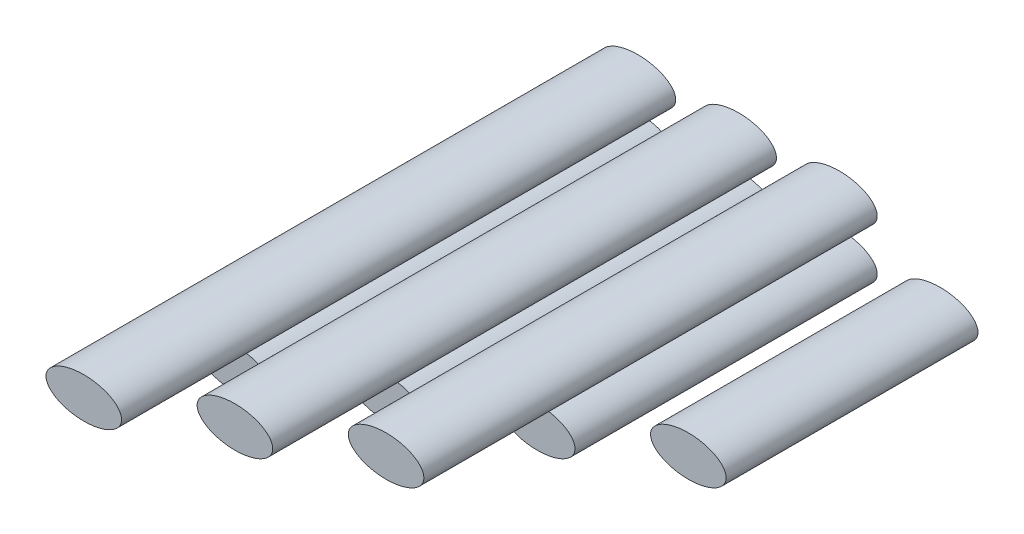
ISO-10303-21;
HEADER;
FILE_DESCRIPTION(('STEP AP214'),'2;1');
FILE_NAME('part.step','',(''),(''),'','','');
FILE_SCHEMA(('AUTOMOTIVE_DESIGN { 1 0 10303 214 1 1 1 1 }'));
ENDSEC;
DATA;
#1=APPLICATION_CONTEXT('core data for automotive mechanical design processes');
#2=APPLICATION_PROTOCOL_DEFINITION('international standard','automotive_design',2000,#1);
#3=PRODUCT_CONTEXT('',#1,'mechanical');
#4=PRODUCT('Part','Part','',(#3));
#5=PRODUCT_RELATED_PRODUCT_CATEGORY('part','',(#4));
#6=PRODUCT_DEFINITION_FORMATION('','',#4);
#7=PRODUCT_DEFINITION_CONTEXT('part definition',#1,'design');
#8=PRODUCT_DEFINITION('design','',#6,#7);
#9=PRODUCT_DEFINITION_SHAPE('','',#8);
#10=(LENGTH_UNIT() NAMED_UNIT(*) SI_UNIT(.MILLI.,.METRE.));
#11=(NAMED_UNIT(*) PLANE_ANGLE_UNIT() SI_UNIT($,.RADIAN.));
#12=(NAMED_UNIT(*) SI_UNIT($,.STERADIAN.) SOLID_ANGLE_UNIT());
#13=UNCERTAINTY_MEASURE_WITH_UNIT(LENGTH_MEASURE(1.E-05),#10,'distance_accuracy_value','');
#14=(GEOMETRIC_REPRESENTATION_CONTEXT(3) GLOBAL_UNCERTAINTY_ASSIGNED_CONTEXT((#13)) GLOBAL_UNIT_ASSIGNED_CONTEXT((#10,
#11,#12)) REPRESENTATION_CONTEXT('',''));
#15=CARTESIAN_POINT('',(0.,0.,0.));
#16=DIRECTION('',(0.,0.,1.));
#17=DIRECTION('',(1.,0.,0.));
#18=AXIS2_PLACEMENT_3D('',#15,#16,#17);
#19=CARTESIAN_POINT('',(0.,2.,22.));
#20=DIRECTION('',(0.,0.,1.));
#21=DIRECTION('',(-1.,0.,0.));
#22=AXIS2_PLACEMENT_3D('',#19,#20,#21);
#23=ELLIPSE('',#22,1.5,0.8);
#24=DIRECTION('',(0.,0.,-1.));
#25=VECTOR('',#24,1.);
#26=SURFACE_OF_LINEAR_EXTRUSION('',#23,#25);
#27=CARTESIAN_POINT('',(-1.50000000000001,2.,22.));
#28=VERTEX_POINT('',#27);
#29=EDGE_CURVE('E11',#28,#28,#23,.T.);
#30=ORIENTED_EDGE('',*,*,#29,.F.);
#31=EDGE_LOOP('',(#30));
#32=FACE_BOUND('',#31,.T.);
#33=CARTESIAN_POINT('',(0.,2.,0.));
#34=DIRECTION('',(0.,0.,1.));
#35=DIRECTION('',(-1.,0.,0.));
#36=AXIS2_PLACEMENT_3D('',#33,#34,#35);
#37=ELLIPSE('',#36,1.5,0.8);
#38=CARTESIAN_POINT('',(-1.50000000000001,2.,0.));
#39=VERTEX_POINT('',#38);
#40=EDGE_CURVE('E44',#39,#39,#37,.T.);
#41=ORIENTED_EDGE('',*,*,#40,.T.);
#42=EDGE_LOOP('',(#41));
#43=FACE_BOUND('',#42,.T.);
#44=ADVANCED_FACE('F40',(#32,#43),#26,.F.);
#45=CARTESIAN_POINT('',(0.,2.,22.));
#46=DIRECTION('',(0.,0.,1.));
#47=DIRECTION('',(1.,0.,0.));
#48=AXIS2_PLACEMENT_3D('',#45,#46,#47);
#49=PLANE('',#48);
#50=ORIENTED_EDGE('',*,*,#29,.T.);
#51=EDGE_LOOP('',(#50));
#52=FACE_BOUND('',#51,.T.);
#53=ADVANCED_FACE('F56',(#52),#49,.T.);
#54=CARTESIAN_POINT('',(0.,2.,0.));
#55=DIRECTION('',(0.,0.,1.));
#56=DIRECTION('',(1.,0.,0.));
#57=AXIS2_PLACEMENT_3D('',#54,#55,#56);
#58=PLANE('',#57);
#59=ORIENTED_EDGE('',*,*,#40,.F.);
#60=EDGE_LOOP('',(#59));
#61=FACE_BOUND('',#60,.T.);
#62=ADVANCED_FACE('F54',(#61),#58,.F.);
#63=CLOSED_SHELL('',(#44,#53,#62));
#64=MANIFOLD_SOLID_BREP('B2',#63);
#65=CARTESIAN_POINT('',(3.99999999999999,2.00000000000006,20.));
#66=DIRECTION('',(0.,0.,1.));
#67=DIRECTION('',(-1.,0.,0.));
#68=AXIS2_PLACEMENT_3D('',#65,#66,#67);
#69=ELLIPSE('',#68,1.5,0.8);
#70=DIRECTION('',(0.,0.,-1.));
#71=VECTOR('',#70,1.);
#72=SURFACE_OF_LINEAR_EXTRUSION('',#69,#71);
#73=CARTESIAN_POINT('',(2.49999999999999,2.00000000000006,20.));
#74=VERTEX_POINT('',#73);
#75=EDGE_CURVE('E39',#74,#74,#69,.T.);
#76=ORIENTED_EDGE('',*,*,#75,.F.);
#77=EDGE_LOOP('',(#76));
#78=FACE_BOUND('',#77,.T.);
#79=CARTESIAN_POINT('',(3.99999999999999,2.00000000000006,0.));
#80=DIRECTION('',(0.,0.,1.));
#81=DIRECTION('',(-1.,0.,0.));
#82=AXIS2_PLACEMENT_3D('',#79,#80,#81);
#83=ELLIPSE('',#82,1.5,0.8);
#84=CARTESIAN_POINT('',(2.49999999999999,2.00000000000006,0.));
#85=VERTEX_POINT('',#84);
#86=EDGE_CURVE('E94',#85,#85,#83,.T.);
#87=ORIENTED_EDGE('',*,*,#86,.T.);
#88=EDGE_LOOP('',(#87));
#89=FACE_BOUND('',#88,.T.);
#90=ADVANCED_FACE('F90',(#78,#89),#72,.F.);
#91=CARTESIAN_POINT('',(3.99999999999999,2.00000000000006,20.));
#92=DIRECTION('',(0.,0.,1.));
#93=DIRECTION('',(1.,0.,0.));
#94=AXIS2_PLACEMENT_3D('',#91,#92,#93);
#95=PLANE('',#94);
#96=ORIENTED_EDGE('',*,*,#75,.T.);
#97=EDGE_LOOP('',(#96));
#98=FACE_BOUND('',#97,.T.);
#99=ADVANCED_FACE('F106',(#98),#95,.T.);
#100=CARTESIAN_POINT('',(3.99999999999999,2.00000000000006,0.));
#101=DIRECTION('',(0.,0.,1.));
#102=DIRECTION('',(1.,0.,0.));
#103=AXIS2_PLACEMENT_3D('',#100,#101,#102);
#104=PLANE('',#103);
#105=ORIENTED_EDGE('',*,*,#86,.F.);
#106=EDGE_LOOP('',(#105));
#107=FACE_BOUND('',#106,.T.);
#108=ADVANCED_FACE('F104',(#107),#104,.F.);
#109=CLOSED_SHELL('',(#90,#99,#108));
#110=MANIFOLD_SOLID_BREP('B6',#109);
#111=CARTESIAN_POINT('',(7.99999999999999,2.00000000000011,18.));
#112=DIRECTION('',(0.,0.,1.));
#113=DIRECTION('',(-1.,0.,0.));
#114=AXIS2_PLACEMENT_3D('',#111,#112,#113);
#115=ELLIPSE('',#114,1.5,0.8);
#116=DIRECTION('',(0.,0.,-1.));
#117=VECTOR('',#116,1.);
#118=SURFACE_OF_LINEAR_EXTRUSION('',#115,#117);
#119=CARTESIAN_POINT('',(6.49999999999999,2.00000000000011,18.));
#120=VERTEX_POINT('',#119);
#121=EDGE_CURVE('E89',#120,#120,#115,.T.);
#122=ORIENTED_EDGE('',*,*,#121,.F.);
#123=EDGE_LOOP('',(#122));
#124=FACE_BOUND('',#123,.T.);
#125=CARTESIAN_POINT('',(7.99999999999999,2.00000000000011,0.));
#126=DIRECTION('',(0.,0.,1.));
#127=DIRECTION('',(-1.,0.,0.));
#128=AXIS2_PLACEMENT_3D('',#125,#126,#127);
#129=ELLIPSE('',#128,1.5,0.8);
#130=CARTESIAN_POINT('',(6.49999999999999,2.00000000000011,0.));
#131=VERTEX_POINT('',#130);
#132=EDGE_CURVE('E144',#131,#131,#129,.T.);
#133=ORIENTED_EDGE('',*,*,#132,.T.);
#134=EDGE_LOOP('',(#133));
#135=FACE_BOUND('',#134,.T.);
#136=ADVANCED_FACE('F140',(#124,#135),#118,.F.);
#137=CARTESIAN_POINT('',(7.99999999999999,2.00000000000011,18.));
#138=DIRECTION('',(0.,0.,1.));
#139=DIRECTION('',(1.,0.,0.));
#140=AXIS2_PLACEMENT_3D('',#137,#138,#139);
#141=PLANE('',#140);
#142=ORIENTED_EDGE('',*,*,#121,.T.);
#143=EDGE_LOOP('',(#142));
#144=FACE_BOUND('',#143,.T.);
#145=ADVANCED_FACE('F156',(#144),#141,.T.);
#146=CARTESIAN_POINT('',(7.99999999999999,2.00000000000011,0.));
#147=DIRECTION('',(0.,0.,1.));
#148=DIRECTION('',(1.,0.,0.));
#149=AXIS2_PLACEMENT_3D('',#146,#147,#148);
#150=PLANE('',#149);
#151=ORIENTED_EDGE('',*,*,#132,.F.);
#152=EDGE_LOOP('',(#151));
#153=FACE_BOUND('',#152,.T.);
#154=ADVANCED_FACE('F154',(#153),#150,.F.);
#155=CLOSED_SHELL('',(#136,#145,#154));
#156=MANIFOLD_SOLID_BREP('B34',#155);
#157=CARTESIAN_POINT('',(0.,0.,16.));
#158=DIRECTION('',(0.,0.,1.));
#159=DIRECTION('',(-1.,0.,0.));
#160=AXIS2_PLACEMENT_3D('',#157,#158,#159);
#161=ELLIPSE('',#160,1.5,0.8);
#162=DIRECTION('',(0.,0.,-1.));
#163=VECTOR('',#162,1.);
#164=SURFACE_OF_LINEAR_EXTRUSION('',#161,#163);
#165=CARTESIAN_POINT('',(-1.5,0.,16.));
#166=VERTEX_POINT('',#165);
#167=EDGE_CURVE('E139',#166,#166,#161,.T.);
#168=ORIENTED_EDGE('',*,*,#167,.F.);
#169=EDGE_LOOP('',(#168));
#170=FACE_BOUND('',#169,.T.);
#171=CARTESIAN_POINT('',(0.,0.,0.));
#172=DIRECTION('',(0.,0.,1.));
#173=DIRECTION('',(-1.,0.,0.));
#174=AXIS2_PLACEMENT_3D('',#171,#172,#173);
#175=ELLIPSE('',#174,1.5,0.8);
#176=CARTESIAN_POINT('',(-1.5,0.,0.));
#177=VERTEX_POINT('',#176);
#178=EDGE_CURVE('E194',#177,#177,#175,.T.);
#179=ORIENTED_EDGE('',*,*,#178,.T.);
#180=EDGE_LOOP('',(#179));
#181=FACE_BOUND('',#180,.T.);
#182=ADVANCED_FACE('F190',(#170,#181),#164,.F.);
#183=CARTESIAN_POINT('',(0.,0.,16.));
#184=DIRECTION('',(0.,0.,1.));
#185=DIRECTION('',(1.,0.,0.));
#186=AXIS2_PLACEMENT_3D('',#183,#184,#185);
#187=PLANE('',#186);
#188=ORIENTED_EDGE('',*,*,#167,.T.);
#189=EDGE_LOOP('',(#188));
#190=FACE_BOUND('',#189,.T.);
#191=ADVANCED_FACE('F206',(#190),#187,.T.);
#192=CARTESIAN_POINT('',(0.,0.,0.));
#193=DIRECTION('',(0.,0.,1.));
#194=DIRECTION('',(1.,0.,0.));
#195=AXIS2_PLACEMENT_3D('',#192,#193,#194);
#196=PLANE('',#195);
#197=ORIENTED_EDGE('',*,*,#178,.F.);
#198=EDGE_LOOP('',(#197));
#199=FACE_BOUND('',#198,.T.);
#200=ADVANCED_FACE('F204',(#199),#196,.F.);
#201=CLOSED_SHELL('',(#182,#191,#200));
#202=MANIFOLD_SOLID_BREP('B84',#201);
#203=CARTESIAN_POINT('',(4.,0.,14.));
#204=DIRECTION('',(0.,0.,1.));
#205=DIRECTION('',(-1.,0.,0.));
#206=AXIS2_PLACEMENT_3D('',#203,#204,#205);
#207=ELLIPSE('',#206,1.5,0.8);
#208=DIRECTION('',(0.,0.,-1.));
#209=VECTOR('',#208,1.);
#210=SURFACE_OF_LINEAR_EXTRUSION('',#207,#209);
#211=CARTESIAN_POINT('',(2.5,0.,14.));
#212=VERTEX_POINT('',#211);
#213=EDGE_CURVE('E189',#212,#212,#207,.T.);
#214=ORIENTED_EDGE('',*,*,#213,.F.);
#215=EDGE_LOOP('',(#214));
#216=FACE_BOUND('',#215,.T.);
#217=CARTESIAN_POINT('',(4.,0.,0.));
#218=DIRECTION('',(0.,0.,1.));
#219=DIRECTION('',(-1.,0.,0.));
#220=AXIS2_PLACEMENT_3D('',#217,#218,#219);
#221=ELLIPSE('',#220,1.5,0.8);
#222=CARTESIAN_POINT('',(2.5,0.,0.));
#223=VERTEX_POINT('',#222);
#224=EDGE_CURVE('E244',#223,#223,#221,.T.);
#225=ORIENTED_EDGE('',*,*,#224,.T.);
#226=EDGE_LOOP('',(#225));
#227=FACE_BOUND('',#226,.T.);
#228=ADVANCED_FACE('F240',(#216,#227),#210,.F.);
#229=CARTESIAN_POINT('',(4.,0.,14.));
#230=DIRECTION('',(0.,0.,1.));
#231=DIRECTION('',(1.,0.,0.));
#232=AXIS2_PLACEMENT_3D('',#229,#230,#231);
#233=PLANE('',#232);
#234=ORIENTED_EDGE('',*,*,#213,.T.);
#235=EDGE_LOOP('',(#234));
#236=FACE_BOUND('',#235,.T.);
#237=ADVANCED_FACE('F256',(#236),#233,.T.);
#238=CARTESIAN_POINT('',(4.,0.,0.));
#239=DIRECTION('',(0.,0.,1.));
#240=DIRECTION('',(1.,0.,0.));
#241=AXIS2_PLACEMENT_3D('',#238,#239,#240);
#242=PLANE('',#241);
#243=ORIENTED_EDGE('',*,*,#224,.F.);
#244=EDGE_LOOP('',(#243));
#245=FACE_BOUND('',#244,.T.);
#246=ADVANCED_FACE('F254',(#245),#242,.F.);
#247=CLOSED_SHELL('',(#228,#237,#246));
#248=MANIFOLD_SOLID_BREP('B134',#247);
#249=CARTESIAN_POINT('',(8.,1.1172740284298E-13,12.));
#250=DIRECTION('',(0.,0.,1.));
#251=DIRECTION('',(-1.,0.,0.));
#252=AXIS2_PLACEMENT_3D('',#249,#250,#251);
#253=ELLIPSE('',#252,1.5,0.8);
#254=DIRECTION('',(0.,0.,-1.));
#255=VECTOR('',#254,1.);
#256=SURFACE_OF_LINEAR_EXTRUSION('',#253,#255);
#257=CARTESIAN_POINT('',(6.5,1.12248824125413E-13,12.));
#258=VERTEX_POINT('',#257);
#259=EDGE_CURVE('E239',#258,#258,#253,.T.);
#260=ORIENTED_EDGE('',*,*,#259,.F.);
#261=EDGE_LOOP('',(#260));
#262=FACE_BOUND('',#261,.T.);
#263=CARTESIAN_POINT('',(8.,1.1172740284298E-13,0.));
#264=DIRECTION('',(0.,0.,1.));
#265=DIRECTION('',(-1.,0.,0.));
#266=AXIS2_PLACEMENT_3D('',#263,#264,#265);
#267=ELLIPSE('',#266,1.5,0.8);
#268=CARTESIAN_POINT('',(6.5,1.12248824125413E-13,0.));
#269=VERTEX_POINT('',#268);
#270=EDGE_CURVE('E293',#269,#269,#267,.T.);
#271=ORIENTED_EDGE('',*,*,#270,.T.);
#272=EDGE_LOOP('',(#271));
#273=FACE_BOUND('',#272,.T.);
#274=ADVANCED_FACE('F289',(#262,#273),#256,.F.);
#275=CARTESIAN_POINT('',(8.,1.1172740284298E-13,12.));
#276=DIRECTION('',(0.,0.,1.));
#277=DIRECTION('',(1.,0.,0.));
#278=AXIS2_PLACEMENT_3D('',#275,#276,#277);
#279=PLANE('',#278);
#280=ORIENTED_EDGE('',*,*,#259,.T.);
#281=EDGE_LOOP('',(#280));
#282=FACE_BOUND('',#281,.T.);
#283=ADVANCED_FACE('F305',(#282),#279,.T.);
#284=CARTESIAN_POINT('',(8.,1.1172740284298E-13,0.));
#285=DIRECTION('',(0.,0.,1.));
#286=DIRECTION('',(1.,0.,0.));
#287=AXIS2_PLACEMENT_3D('',#284,#285,#286);
#288=PLANE('',#287);
#289=ORIENTED_EDGE('',*,*,#270,.F.);
#290=EDGE_LOOP('',(#289));
#291=FACE_BOUND('',#290,.T.);
#292=ADVANCED_FACE('F303',(#291),#288,.F.);
#293=CLOSED_SHELL('',(#274,#283,#292));
#294=MANIFOLD_SOLID_BREP('B184',#293);
#295=CARTESIAN_POINT('',(12.,1.6759110426447E-13,10.));
#296=DIRECTION('',(0.,0.,1.));
#297=DIRECTION('',(-1.,0.,0.));
#298=AXIS2_PLACEMENT_3D('',#295,#296,#297);
#299=ELLIPSE('',#298,1.5,0.8);
#300=DIRECTION('',(0.,0.,-1.));
#301=VECTOR('',#300,1.);
#302=SURFACE_OF_LINEAR_EXTRUSION('',#299,#301);
#303=CARTESIAN_POINT('',(10.5,1.68112525546903E-13,10.));
#304=VERTEX_POINT('',#303);
#305=EDGE_CURVE('E288',#304,#304,#299,.T.);
#306=ORIENTED_EDGE('',*,*,#305,.F.);
#307=EDGE_LOOP('',(#306));
#308=FACE_BOUND('',#307,.T.);
#309=CARTESIAN_POINT('',(12.,1.6759110426447E-13,0.));
#310=DIRECTION('',(0.,0.,1.));
#311=DIRECTION('',(-1.,0.,0.));
#312=AXIS2_PLACEMENT_3D('',#309,#310,#311);
#313=ELLIPSE('',#312,1.5,0.8);
#314=CARTESIAN_POINT('',(10.5,1.68112525546903E-13,0.));
#315=VERTEX_POINT('',#314);
#316=EDGE_CURVE('E335',#315,#315,#313,.T.);
#317=ORIENTED_EDGE('',*,*,#316,.T.);
#318=EDGE_LOOP('',(#317));
#319=FACE_BOUND('',#318,.T.);
#320=ADVANCED_FACE('F331',(#308,#319),#302,.F.);
#321=CARTESIAN_POINT('',(12.,1.6759110426447E-13,10.));
#322=DIRECTION('',(0.,0.,1.));
#323=DIRECTION('',(1.,0.,0.));
#324=AXIS2_PLACEMENT_3D('',#321,#322,#323);
#325=PLANE('',#324);
#326=ORIENTED_EDGE('',*,*,#305,.T.);
#327=EDGE_LOOP('',(#326));
#328=FACE_BOUND('',#327,.T.);
#329=ADVANCED_FACE('F347',(#328),#325,.T.);
#330=CARTESIAN_POINT('',(12.,1.6759110426447E-13,0.));
#331=DIRECTION('',(0.,0.,1.));
#332=DIRECTION('',(1.,0.,0.));
#333=AXIS2_PLACEMENT_3D('',#330,#331,#332);
#334=PLANE('',#333);
#335=ORIENTED_EDGE('',*,*,#316,.F.);
#336=EDGE_LOOP('',(#335));
#337=FACE_BOUND('',#336,.T.);
#338=ADVANCED_FACE('F345',(#337),#334,.F.);
#339=CLOSED_SHELL('',(#320,#329,#338));
#340=MANIFOLD_SOLID_BREP('B234',#339);
#341=ADVANCED_BREP_SHAPE_REPRESENTATION('',(#18,#64,#110,#156,#202,#248,#294,#340),#14);
#342=SHAPE_DEFINITION_REPRESENTATION(#9,#341);
ENDSEC;
END-ISO-10303-21;
